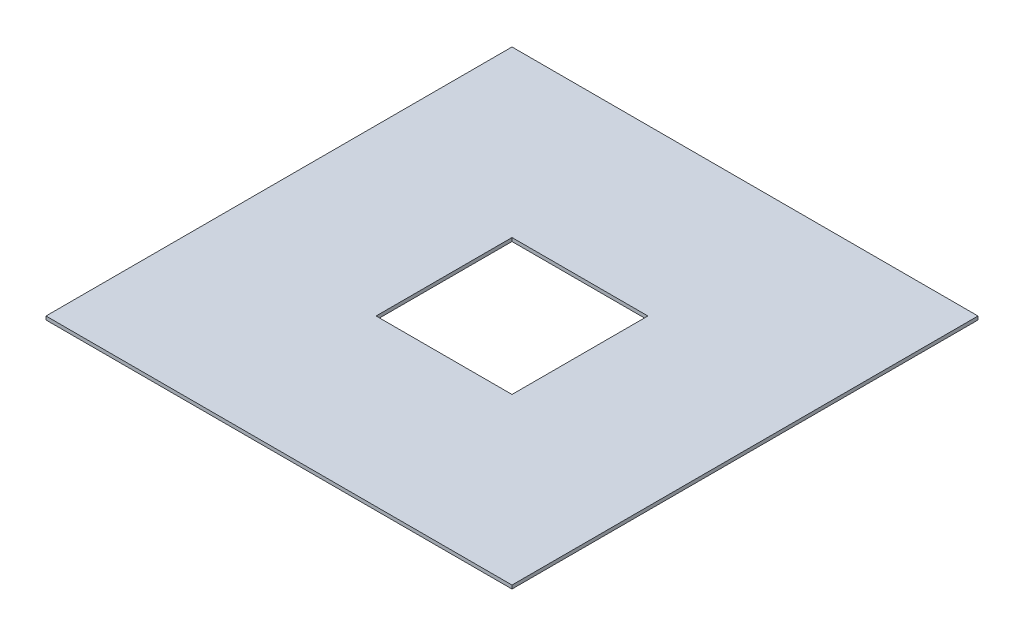
ISO-10303-21;
HEADER;
FILE_DESCRIPTION(('STEP AP214'),'2;1');
FILE_NAME('part.step','',(''),(''),'','','');
FILE_SCHEMA(('AUTOMOTIVE_DESIGN { 1 0 10303 214 1 1 1 1 }'));
ENDSEC;
DATA;
#1=APPLICATION_CONTEXT('core data for automotive mechanical design processes');
#2=APPLICATION_PROTOCOL_DEFINITION('international standard','automotive_design',2000,#1);
#3=PRODUCT_CONTEXT('',#1,'mechanical');
#4=PRODUCT('Part','Part','',(#3));
#5=PRODUCT_RELATED_PRODUCT_CATEGORY('part','',(#4));
#6=PRODUCT_DEFINITION_FORMATION('','',#4);
#7=PRODUCT_DEFINITION_CONTEXT('part definition',#1,'design');
#8=PRODUCT_DEFINITION('design','',#6,#7);
#9=PRODUCT_DEFINITION_SHAPE('','',#8);
#10=(LENGTH_UNIT() NAMED_UNIT(*) SI_UNIT(.MILLI.,.METRE.));
#11=(NAMED_UNIT(*) PLANE_ANGLE_UNIT() SI_UNIT($,.RADIAN.));
#12=(NAMED_UNIT(*) SI_UNIT($,.STERADIAN.) SOLID_ANGLE_UNIT());
#13=UNCERTAINTY_MEASURE_WITH_UNIT(LENGTH_MEASURE(1.E-05),#10,'distance_accuracy_value','');
#14=(GEOMETRIC_REPRESENTATION_CONTEXT(3) GLOBAL_UNCERTAINTY_ASSIGNED_CONTEXT((#13)) GLOBAL_UNIT_ASSIGNED_CONTEXT((#10,
#11,#12)) REPRESENTATION_CONTEXT('',''));
#15=CARTESIAN_POINT('',(0.,0.,0.));
#16=DIRECTION('',(0.,0.,1.));
#17=DIRECTION('',(1.,0.,0.));
#18=AXIS2_PLACEMENT_3D('',#15,#16,#17);
#19=CARTESIAN_POINT('',(0.,3.25180127018922,0.));
#20=DIRECTION('',(0.,1.,0.));
#21=DIRECTION('',(0.,0.,1.));
#22=AXIS2_PLACEMENT_3D('',#19,#20,#21);
#23=PLANE('',#22);
#24=DIRECTION('',(0.,0.,-1.));
#25=VECTOR('',#24,1.);
#26=CARTESIAN_POINT('',(1.2,3.25180127018922,-1.2));
#27=LINE('',#26,#25);
#28=CARTESIAN_POINT('',(1.2,3.25180127018922,1.2));
#29=VERTEX_POINT('',#28);
#30=CARTESIAN_POINT('',(1.2,3.25180127018922,-1.2));
#31=VERTEX_POINT('',#30);
#32=EDGE_CURVE('E137',#29,#31,#27,.T.);
#33=ORIENTED_EDGE('',*,*,#32,.T.);
#34=DIRECTION('',(-1.,0.,0.));
#35=VECTOR('',#34,1.);
#36=CARTESIAN_POINT('',(-1.2,3.25180127018922,-1.2));
#37=LINE('',#36,#35);
#38=CARTESIAN_POINT('',(-1.2,3.25180127018922,-1.2));
#39=VERTEX_POINT('',#38);
#40=EDGE_CURVE('E140',#31,#39,#37,.T.);
#41=ORIENTED_EDGE('',*,*,#40,.T.);
#42=DIRECTION('',(0.,0.,1.));
#43=VECTOR('',#42,1.);
#44=CARTESIAN_POINT('',(-1.2,3.25180127018922,-1.2));
#45=LINE('',#44,#43);
#46=CARTESIAN_POINT('',(-1.2,3.25180127018922,1.2));
#47=VERTEX_POINT('',#46);
#48=EDGE_CURVE('E143',#39,#47,#45,.T.);
#49=ORIENTED_EDGE('',*,*,#48,.T.);
#50=DIRECTION('',(1.,0.,0.));
#51=VECTOR('',#50,1.);
#52=CARTESIAN_POINT('',(-1.2,3.25180127018922,1.2));
#53=LINE('',#52,#51);
#54=EDGE_CURVE('E145',#47,#29,#53,.T.);
#55=ORIENTED_EDGE('',*,*,#54,.T.);
#56=EDGE_LOOP('',(#33,#41,#49,#55));
#57=FACE_BOUND('',#56,.T.);
#58=DIRECTION('',(-1.,0.,0.));
#59=VECTOR('',#58,1.);
#60=CARTESIAN_POINT('',(-0.35,3.25180127018922,-0.35));
#61=LINE('',#60,#59);
#62=CARTESIAN_POINT('',(0.35,3.25180127018922,-0.35));
#63=VERTEX_POINT('',#62);
#64=CARTESIAN_POINT('',(-0.35,3.25180127018922,-0.35));
#65=VERTEX_POINT('',#64);
#66=EDGE_CURVE('E109',#63,#65,#61,.T.);
#67=ORIENTED_EDGE('',*,*,#66,.F.);
#68=DIRECTION('',(0.,0.,-1.));
#69=VECTOR('',#68,1.);
#70=CARTESIAN_POINT('',(0.35,3.25180127018922,-0.35));
#71=LINE('',#70,#69);
#72=CARTESIAN_POINT('',(0.35,3.25180127018922,0.35));
#73=VERTEX_POINT('',#72);
#74=EDGE_CURVE('E101',#73,#63,#71,.T.);
#75=ORIENTED_EDGE('',*,*,#74,.F.);
#76=DIRECTION('',(1.,0.,0.));
#77=VECTOR('',#76,1.);
#78=CARTESIAN_POINT('',(-0.35,3.25180127018922,0.35));
#79=LINE('',#78,#77);
#80=CARTESIAN_POINT('',(-0.35,3.25180127018922,0.35));
#81=VERTEX_POINT('',#80);
#82=EDGE_CURVE('E123',#81,#73,#79,.T.);
#83=ORIENTED_EDGE('',*,*,#82,.F.);
#84=DIRECTION('',(0.,0.,1.));
#85=VECTOR('',#84,1.);
#86=CARTESIAN_POINT('',(-0.35,3.25180127018922,-0.35));
#87=LINE('',#86,#85);
#88=EDGE_CURVE('E121',#65,#81,#87,.T.);
#89=ORIENTED_EDGE('',*,*,#88,.F.);
#90=EDGE_LOOP('',(#67,#75,#83,#89));
#91=FACE_BOUND('',#90,.T.);
#92=ADVANCED_FACE('F36',(#57,#91),#23,.T.);
#93=CARTESIAN_POINT('',(0.,3.23380127018922,0.));
#94=DIRECTION('',(0.,1.,0.));
#95=DIRECTION('',(0.,0.,1.));
#96=AXIS2_PLACEMENT_3D('',#93,#94,#95);
#97=PLANE('',#96);
#98=DIRECTION('',(0.,0.,-1.));
#99=VECTOR('',#98,1.);
#100=CARTESIAN_POINT('',(1.2,3.23380127018922,-1.2));
#101=LINE('',#100,#99);
#102=CARTESIAN_POINT('',(1.2,3.23380127018922,1.2));
#103=VERTEX_POINT('',#102);
#104=CARTESIAN_POINT('',(1.2,3.23380127018922,-1.2));
#105=VERTEX_POINT('',#104);
#106=EDGE_CURVE('E117',#103,#105,#101,.T.);
#107=ORIENTED_EDGE('',*,*,#106,.F.);
#108=DIRECTION('',(1.,0.,0.));
#109=VECTOR('',#108,1.);
#110=CARTESIAN_POINT('',(-1.2,3.23380127018922,1.2));
#111=LINE('',#110,#109);
#112=CARTESIAN_POINT('',(-1.2,3.23380127018922,1.2));
#113=VERTEX_POINT('',#112);
#114=EDGE_CURVE('E141',#113,#103,#111,.T.);
#115=ORIENTED_EDGE('',*,*,#114,.F.);
#116=DIRECTION('',(0.,0.,1.));
#117=VECTOR('',#116,1.);
#118=CARTESIAN_POINT('',(-1.2,3.23380127018922,-1.2));
#119=LINE('',#118,#117);
#120=CARTESIAN_POINT('',(-1.2,3.23380127018922,-1.2));
#121=VERTEX_POINT('',#120);
#122=EDGE_CURVE('E152',#121,#113,#119,.T.);
#123=ORIENTED_EDGE('',*,*,#122,.F.);
#124=DIRECTION('',(-1.,0.,0.));
#125=VECTOR('',#124,1.);
#126=CARTESIAN_POINT('',(-1.2,3.23380127018922,-1.2));
#127=LINE('',#126,#125);
#128=EDGE_CURVE('E150',#105,#121,#127,.T.);
#129=ORIENTED_EDGE('',*,*,#128,.F.);
#130=EDGE_LOOP('',(#107,#115,#123,#129));
#131=FACE_BOUND('',#130,.T.);
#132=DIRECTION('',(0.,0.,-1.));
#133=VECTOR('',#132,1.);
#134=CARTESIAN_POINT('',(0.35,3.23380127018922,-0.35));
#135=LINE('',#134,#133);
#136=CARTESIAN_POINT('',(0.35,3.23380127018922,0.35));
#137=VERTEX_POINT('',#136);
#138=CARTESIAN_POINT('',(0.35,3.23380127018922,-0.35));
#139=VERTEX_POINT('',#138);
#140=EDGE_CURVE('E59',#137,#139,#135,.T.);
#141=ORIENTED_EDGE('',*,*,#140,.T.);
#142=DIRECTION('',(-1.,0.,0.));
#143=VECTOR('',#142,1.);
#144=CARTESIAN_POINT('',(-0.35,3.23380127018922,-0.35));
#145=LINE('',#144,#143);
#146=CARTESIAN_POINT('',(-0.35,3.23380127018922,-0.35));
#147=VERTEX_POINT('',#146);
#148=EDGE_CURVE('E116',#139,#147,#145,.T.);
#149=ORIENTED_EDGE('',*,*,#148,.T.);
#150=DIRECTION('',(0.,0.,1.));
#151=VECTOR('',#150,1.);
#152=CARTESIAN_POINT('',(-0.35,3.23380127018922,-0.35));
#153=LINE('',#152,#151);
#154=CARTESIAN_POINT('',(-0.35,3.23380127018922,0.35));
#155=VERTEX_POINT('',#154);
#156=EDGE_CURVE('E129',#147,#155,#153,.T.);
#157=ORIENTED_EDGE('',*,*,#156,.T.);
#158=DIRECTION('',(1.,0.,0.));
#159=VECTOR('',#158,1.);
#160=CARTESIAN_POINT('',(-0.35,3.23380127018922,0.35));
#161=LINE('',#160,#159);
#162=EDGE_CURVE('E110',#155,#137,#161,.T.);
#163=ORIENTED_EDGE('',*,*,#162,.T.);
#164=EDGE_LOOP('',(#141,#149,#157,#163));
#165=FACE_BOUND('',#164,.T.);
#166=ADVANCED_FACE('F170',(#131,#165),#97,.F.);
#167=CARTESIAN_POINT('',(1.2,3.25180127018922,-1.2));
#168=DIRECTION('',(-1.,0.,0.));
#169=DIRECTION('',(0.,0.,1.));
#170=AXIS2_PLACEMENT_3D('',#167,#168,#169);
#171=PLANE('',#170);
#172=ORIENTED_EDGE('',*,*,#106,.T.);
#173=DIRECTION('',(0.,-1.,0.));
#174=VECTOR('',#173,1.);
#175=CARTESIAN_POINT('',(1.2,3.25180127018922,-1.2));
#176=LINE('',#175,#174);
#177=EDGE_CURVE('E11',#31,#105,#176,.T.);
#178=ORIENTED_EDGE('',*,*,#177,.F.);
#179=ORIENTED_EDGE('',*,*,#32,.F.);
#180=DIRECTION('',(0.,-1.,0.));
#181=VECTOR('',#180,1.);
#182=CARTESIAN_POINT('',(1.2,3.25180127018922,1.2));
#183=LINE('',#182,#181);
#184=EDGE_CURVE('E147',#29,#103,#183,.T.);
#185=ORIENTED_EDGE('',*,*,#184,.T.);
#186=EDGE_LOOP('',(#172,#178,#179,#185));
#187=FACE_BOUND('',#186,.T.);
#188=ADVANCED_FACE('F38',(#187),#171,.F.);
#189=CARTESIAN_POINT('',(-1.2,3.25180127018922,-1.2));
#190=DIRECTION('',(0.,0.,1.));
#191=DIRECTION('',(1.,0.,0.));
#192=AXIS2_PLACEMENT_3D('',#189,#190,#191);
#193=PLANE('',#192);
#194=ORIENTED_EDGE('',*,*,#128,.T.);
#195=DIRECTION('',(0.,-1.,0.));
#196=VECTOR('',#195,1.);
#197=CARTESIAN_POINT('',(-1.2,3.25180127018922,-1.2));
#198=LINE('',#197,#196);
#199=EDGE_CURVE('E44',#39,#121,#198,.T.);
#200=ORIENTED_EDGE('',*,*,#199,.F.);
#201=ORIENTED_EDGE('',*,*,#40,.F.);
#202=ORIENTED_EDGE('',*,*,#177,.T.);
#203=EDGE_LOOP('',(#194,#200,#201,#202));
#204=FACE_BOUND('',#203,.T.);
#205=ADVANCED_FACE('F180',(#204),#193,.F.);
#206=CARTESIAN_POINT('',(-1.2,3.25180127018922,-1.2));
#207=DIRECTION('',(1.,0.,0.));
#208=DIRECTION('',(0.,0.,-1.));
#209=AXIS2_PLACEMENT_3D('',#206,#207,#208);
#210=PLANE('',#209);
#211=ORIENTED_EDGE('',*,*,#122,.T.);
#212=DIRECTION('',(0.,-1.,0.));
#213=VECTOR('',#212,1.);
#214=CARTESIAN_POINT('',(-1.2,3.25180127018922,1.2));
#215=LINE('',#214,#213);
#216=EDGE_CURVE('E157',#47,#113,#215,.T.);
#217=ORIENTED_EDGE('',*,*,#216,.F.);
#218=ORIENTED_EDGE('',*,*,#48,.F.);
#219=ORIENTED_EDGE('',*,*,#199,.T.);
#220=EDGE_LOOP('',(#211,#217,#218,#219));
#221=FACE_BOUND('',#220,.T.);
#222=ADVANCED_FACE('F164',(#221),#210,.F.);
#223=CARTESIAN_POINT('',(-1.2,3.25180127018922,1.2));
#224=DIRECTION('',(0.,0.,-1.));
#225=DIRECTION('',(-1.,0.,0.));
#226=AXIS2_PLACEMENT_3D('',#223,#224,#225);
#227=PLANE('',#226);
#228=ORIENTED_EDGE('',*,*,#114,.T.);
#229=ORIENTED_EDGE('',*,*,#184,.F.);
#230=ORIENTED_EDGE('',*,*,#54,.F.);
#231=ORIENTED_EDGE('',*,*,#216,.T.);
#232=EDGE_LOOP('',(#228,#229,#230,#231));
#233=FACE_BOUND('',#232,.T.);
#234=ADVANCED_FACE('F174',(#233),#227,.F.);
#235=CARTESIAN_POINT('',(0.35,3.25180127018922,-0.35));
#236=DIRECTION('',(-1.,0.,0.));
#237=DIRECTION('',(0.,0.,1.));
#238=AXIS2_PLACEMENT_3D('',#235,#236,#237);
#239=PLANE('',#238);
#240=ORIENTED_EDGE('',*,*,#140,.F.);
#241=DIRECTION('',(0.,-1.,0.));
#242=VECTOR('',#241,1.);
#243=CARTESIAN_POINT('',(0.35,3.25180127018922,0.35));
#244=LINE('',#243,#242);
#245=EDGE_CURVE('E105',#73,#137,#244,.T.);
#246=ORIENTED_EDGE('',*,*,#245,.F.);
#247=ORIENTED_EDGE('',*,*,#74,.T.);
#248=DIRECTION('',(0.,-1.,0.));
#249=VECTOR('',#248,1.);
#250=CARTESIAN_POINT('',(0.35,3.25180127018922,-0.35));
#251=LINE('',#250,#249);
#252=EDGE_CURVE('E104',#63,#139,#251,.T.);
#253=ORIENTED_EDGE('',*,*,#252,.T.);
#254=EDGE_LOOP('',(#240,#246,#247,#253));
#255=FACE_BOUND('',#254,.T.);
#256=ADVANCED_FACE('F103',(#255),#239,.T.);
#257=CARTESIAN_POINT('',(-0.35,3.25180127018922,-0.35));
#258=DIRECTION('',(0.,0.,1.));
#259=DIRECTION('',(1.,0.,0.));
#260=AXIS2_PLACEMENT_3D('',#257,#258,#259);
#261=PLANE('',#260);
#262=ORIENTED_EDGE('',*,*,#148,.F.);
#263=ORIENTED_EDGE('',*,*,#252,.F.);
#264=ORIENTED_EDGE('',*,*,#66,.T.);
#265=DIRECTION('',(0.,-1.,0.));
#266=VECTOR('',#265,1.);
#267=CARTESIAN_POINT('',(-0.35,3.25180127018922,-0.35));
#268=LINE('',#267,#266);
#269=EDGE_CURVE('E118',#65,#147,#268,.T.);
#270=ORIENTED_EDGE('',*,*,#269,.T.);
#271=EDGE_LOOP('',(#262,#263,#264,#270));
#272=FACE_BOUND('',#271,.T.);
#273=ADVANCED_FACE('F113',(#272),#261,.T.);
#274=CARTESIAN_POINT('',(-0.35,3.25180127018922,-0.35));
#275=DIRECTION('',(1.,0.,0.));
#276=DIRECTION('',(0.,0.,-1.));
#277=AXIS2_PLACEMENT_3D('',#274,#275,#276);
#278=PLANE('',#277);
#279=ORIENTED_EDGE('',*,*,#156,.F.);
#280=ORIENTED_EDGE('',*,*,#269,.F.);
#281=ORIENTED_EDGE('',*,*,#88,.T.);
#282=DIRECTION('',(0.,-1.,0.));
#283=VECTOR('',#282,1.);
#284=CARTESIAN_POINT('',(-0.35,3.25180127018922,0.35));
#285=LINE('',#284,#283);
#286=EDGE_CURVE('E51',#81,#155,#285,.T.);
#287=ORIENTED_EDGE('',*,*,#286,.T.);
#288=EDGE_LOOP('',(#279,#280,#281,#287));
#289=FACE_BOUND('',#288,.T.);
#290=ADVANCED_FACE('F203',(#289),#278,.T.);
#291=CARTESIAN_POINT('',(-0.35,3.25180127018922,0.35));
#292=DIRECTION('',(0.,0.,-1.));
#293=DIRECTION('',(-1.,0.,0.));
#294=AXIS2_PLACEMENT_3D('',#291,#292,#293);
#295=PLANE('',#294);
#296=ORIENTED_EDGE('',*,*,#162,.F.);
#297=ORIENTED_EDGE('',*,*,#286,.F.);
#298=ORIENTED_EDGE('',*,*,#82,.T.);
#299=ORIENTED_EDGE('',*,*,#245,.T.);
#300=EDGE_LOOP('',(#296,#297,#298,#299));
#301=FACE_BOUND('',#300,.T.);
#302=ADVANCED_FACE('F207',(#301),#295,.T.);
#303=CLOSED_SHELL('',(#92,#166,#188,#205,#222,#234,#256,#273,#290,#302));
#304=MANIFOLD_SOLID_BREP('B2',#303);
#305=ADVANCED_BREP_SHAPE_REPRESENTATION('',(#18,#304),#14);
#306=SHAPE_DEFINITION_REPRESENTATION(#9,#305);
ENDSEC;
END-ISO-10303-21;
